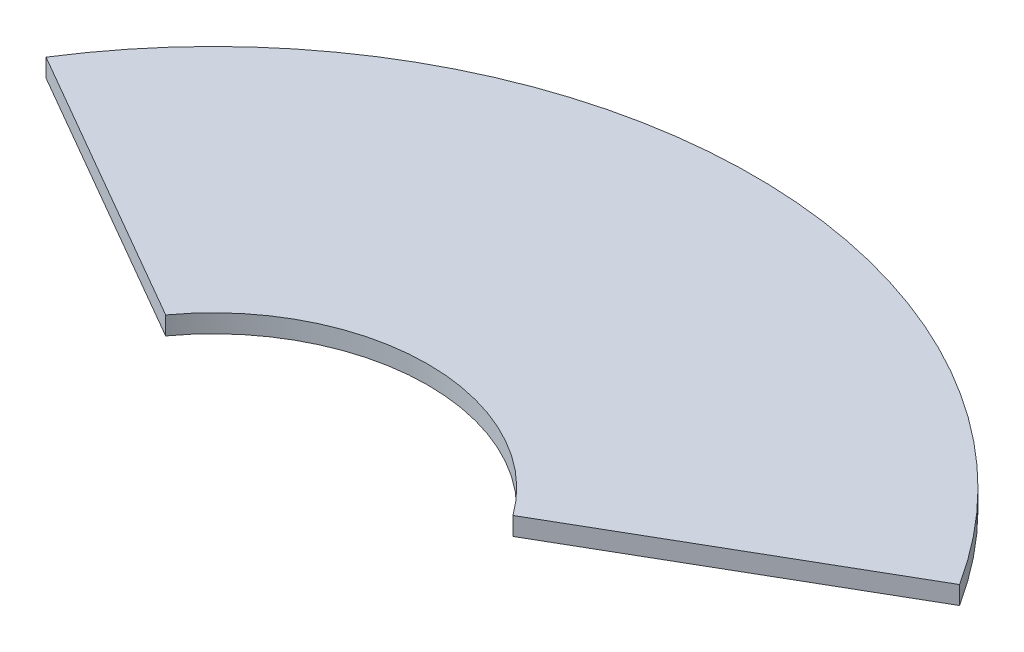
ISO-10303-21;
HEADER;
FILE_DESCRIPTION(('STEP AP214'),'2;1');
FILE_NAME('part.step','',(''),(''),'','','');
FILE_SCHEMA(('AUTOMOTIVE_DESIGN { 1 0 10303 214 1 1 1 1 }'));
ENDSEC;
DATA;
#1=APPLICATION_CONTEXT('core data for automotive mechanical design processes');
#2=APPLICATION_PROTOCOL_DEFINITION('international standard','automotive_design',2000,#1);
#3=PRODUCT_CONTEXT('',#1,'mechanical');
#4=PRODUCT('Part','Part','',(#3));
#5=PRODUCT_RELATED_PRODUCT_CATEGORY('part','',(#4));
#6=PRODUCT_DEFINITION_FORMATION('','',#4);
#7=PRODUCT_DEFINITION_CONTEXT('part definition',#1,'design');
#8=PRODUCT_DEFINITION('design','',#6,#7);
#9=PRODUCT_DEFINITION_SHAPE('','',#8);
#10=(LENGTH_UNIT() NAMED_UNIT(*) SI_UNIT(.MILLI.,.METRE.));
#11=(NAMED_UNIT(*) PLANE_ANGLE_UNIT() SI_UNIT($,.RADIAN.));
#12=(NAMED_UNIT(*) SI_UNIT($,.STERADIAN.) SOLID_ANGLE_UNIT());
#13=UNCERTAINTY_MEASURE_WITH_UNIT(LENGTH_MEASURE(1.E-05),#10,'distance_accuracy_value','');
#14=(GEOMETRIC_REPRESENTATION_CONTEXT(3) GLOBAL_UNCERTAINTY_ASSIGNED_CONTEXT((#13)) GLOBAL_UNIT_ASSIGNED_CONTEXT((#10,
#11,#12)) REPRESENTATION_CONTEXT('',''));
#15=CARTESIAN_POINT('',(0.,0.,0.));
#16=DIRECTION('',(0.,0.,1.));
#17=DIRECTION('',(1.,0.,0.));
#18=AXIS2_PLACEMENT_3D('',#15,#16,#17);
#19=CARTESIAN_POINT('',(11.,145.863295464487,-8.66025403784442));
#20=DIRECTION('',(0.981980506061966,0.,0.188982236504611));
#21=DIRECTION('',(0.188982236504611,0.,-0.981980506061966));
#22=AXIS2_PLACEMENT_3D('',#19,#20,#21);
#23=PLANE('',#22);
#24=DIRECTION('',(0.188982236504611,0.,-0.981980506061966));
#25=VECTOR('',#24,1.);
#26=CARTESIAN_POINT('',(11.,146.999,-8.66025403784442));
#27=LINE('',#26,#25);
#28=CARTESIAN_POINT('',(10.8461182539131,146.999,-7.86066103010504));
#29=VERTEX_POINT('',#28);
#30=CARTESIAN_POINT('',(10.8487709779865,146.999,-7.87444498872569));
#31=VERTEX_POINT('',#30);
#32=EDGE_CURVE('E112',#29,#31,#27,.T.);
#33=ORIENTED_EDGE('',*,*,#32,.F.);
#34=DIRECTION('',(0.,1.,0.));
#35=VECTOR('',#34,1.);
#36=CARTESIAN_POINT('',(10.8461182539131,145.863295464487,-7.86066103010504));
#37=LINE('',#36,#35);
#38=CARTESIAN_POINT('',(10.8461182539131,145.863295464487,-7.86066103010504));
#39=VERTEX_POINT('',#38);
#40=EDGE_CURVE('E32',#39,#29,#37,.T.);
#41=ORIENTED_EDGE('',*,*,#40,.F.);
#42=DIRECTION('',(0.188982236504611,0.,-0.981980506061966));
#43=VECTOR('',#42,1.);
#44=CARTESIAN_POINT('',(11.,145.863295464487,-8.66025403784442));
#45=LINE('',#44,#43);
#46=CARTESIAN_POINT('',(10.8487709779865,145.863295464487,-7.87444498872569));
#47=VERTEX_POINT('',#46);
#48=EDGE_CURVE('E132',#39,#47,#45,.T.);
#49=ORIENTED_EDGE('',*,*,#48,.T.);
#50=DIRECTION('',(0.,1.,0.));
#51=VECTOR('',#50,1.);
#52=CARTESIAN_POINT('',(10.8487709779865,145.863295464487,-7.87444498872569));
#53=LINE('',#52,#51);
#54=EDGE_CURVE('E10',#47,#31,#53,.T.);
#55=ORIENTED_EDGE('',*,*,#54,.T.);
#56=EDGE_LOOP('',(#33,#41,#49,#55));
#57=FACE_BOUND('',#56,.T.);
#58=ADVANCED_FACE('F16',(#57),#23,.T.);
#59=CARTESIAN_POINT('',(10.8487709779865,145.863295464487,-7.87444498872569));
#60=DIRECTION('',(0.500000000000004,0.,0.866025403784436));
#61=DIRECTION('',(0.866025403784436,0.,-0.500000000000004));
#62=AXIS2_PLACEMENT_3D('',#59,#60,#61);
#63=PLANE('',#62);
#64=DIRECTION('',(0.866025403784436,0.,-0.500000000000004));
#65=VECTOR('',#64,1.);
#66=CARTESIAN_POINT('',(10.8487709779865,146.999,-7.87444498872569));
#67=LINE('',#66,#65);
#68=CARTESIAN_POINT('',(28.5152924804553,146.999,-18.0742159338205));
#69=VERTEX_POINT('',#68);
#70=EDGE_CURVE('E115',#31,#69,#67,.T.);
#71=ORIENTED_EDGE('',*,*,#70,.F.);
#72=ORIENTED_EDGE('',*,*,#54,.F.);
#73=DIRECTION('',(0.866025403784436,0.,-0.500000000000004));
#74=VECTOR('',#73,1.);
#75=CARTESIAN_POINT('',(10.8487709779865,145.863295464487,-7.87444498872569));
#76=LINE('',#75,#74);
#77=CARTESIAN_POINT('',(28.5152924804553,145.863295464487,-18.0742159338205));
#78=VERTEX_POINT('',#77);
#79=EDGE_CURVE('E141',#47,#78,#76,.T.);
#80=ORIENTED_EDGE('',*,*,#79,.T.);
#81=DIRECTION('',(0.,1.,0.));
#82=VECTOR('',#81,1.);
#83=CARTESIAN_POINT('',(28.5152924804553,145.863295464487,-18.0742159338205));
#84=LINE('',#83,#82);
#85=EDGE_CURVE('E24',#78,#69,#84,.T.);
#86=ORIENTED_EDGE('',*,*,#85,.T.);
#87=EDGE_LOOP('',(#71,#72,#80,#86));
#88=FACE_BOUND('',#87,.T.);
#89=ADVANCED_FACE('F140',(#88),#63,.T.);
#90=CARTESIAN_POINT('',(28.5152924804554,145.863295464487,-18.0742159338205));
#91=DIRECTION('',(0.229549731573595,0.,-0.973296933486637));
#92=DIRECTION('',(-0.973296933486637,0.,-0.229549731573595));
#93=AXIS2_PLACEMENT_3D('',#90,#91,#92);
#94=PLANE('',#93);
#95=DIRECTION('',(-0.973296933486637,0.,-0.229549731573595));
#96=VECTOR('',#95,1.);
#97=CARTESIAN_POINT('',(28.5152924804554,146.999,-18.0742159338205));
#98=LINE('',#97,#96);
#99=CARTESIAN_POINT('',(28.5067781376292,146.999,-18.0762240210167));
#100=VERTEX_POINT('',#99);
#101=EDGE_CURVE('E118',#69,#100,#98,.T.);
#102=ORIENTED_EDGE('',*,*,#101,.F.);
#103=ORIENTED_EDGE('',*,*,#85,.F.);
#104=DIRECTION('',(-0.973296933486637,0.,-0.229549731573595));
#105=VECTOR('',#104,1.);
#106=CARTESIAN_POINT('',(28.5152924804554,145.863295464487,-18.0742159338205));
#107=LINE('',#106,#105);
#108=CARTESIAN_POINT('',(28.5067781376292,145.863295464487,-18.0762240210167));
#109=VERTEX_POINT('',#108);
#110=EDGE_CURVE('E150',#78,#109,#107,.T.);
#111=ORIENTED_EDGE('',*,*,#110,.T.);
#112=DIRECTION('',(0.,1.,0.));
#113=VECTOR('',#112,1.);
#114=CARTESIAN_POINT('',(28.5067781376292,145.863295464487,-18.0762240210167));
#115=LINE('',#114,#113);
#116=EDGE_CURVE('E138',#109,#100,#115,.T.);
#117=ORIENTED_EDGE('',*,*,#116,.T.);
#118=EDGE_LOOP('',(#102,#103,#111,#117));
#119=FACE_BOUND('',#118,.T.);
#120=ADVANCED_FACE('F145',(#119),#94,.T.);
#121=CARTESIAN_POINT('',(0.,145.863295464487,0.));
#122=DIRECTION('',(0.,1.,0.));
#123=DIRECTION('',(0.,0.,1.));
#124=AXIS2_PLACEMENT_3D('',#121,#122,#123);
#125=CYLINDRICAL_SURFACE('',#124,33.7547963206119);
#126=CARTESIAN_POINT('',(0.,146.999,0.));
#127=DIRECTION('',(0.,1.,0.));
#128=DIRECTION('',(0.844525259962001,0.,-0.535515718990689));
#129=AXIS2_PLACEMENT_3D('',#126,#127,#128);
#130=CIRCLE('',#129,33.7547963206119);
#131=CARTESIAN_POINT('',(-28.5067781376294,146.999,-18.0762240210163));
#132=VERTEX_POINT('',#131);
#133=EDGE_CURVE('E121',#100,#132,#130,.T.);
#134=ORIENTED_EDGE('',*,*,#133,.F.);
#135=ORIENTED_EDGE('',*,*,#116,.F.);
#136=CARTESIAN_POINT('',(0.,145.863295464487,0.));
#137=DIRECTION('',(0.,1.,0.));
#138=DIRECTION('',(0.844525259962001,0.,-0.535515718990689));
#139=AXIS2_PLACEMENT_3D('',#136,#137,#138);
#140=CIRCLE('',#139,33.7547963206119);
#141=CARTESIAN_POINT('',(-28.5067781376294,145.863295464487,-18.0762240210163));
#142=VERTEX_POINT('',#141);
#143=EDGE_CURVE('E154',#109,#142,#140,.T.);
#144=ORIENTED_EDGE('',*,*,#143,.T.);
#145=DIRECTION('',(0.,1.,0.));
#146=VECTOR('',#145,1.);
#147=CARTESIAN_POINT('',(-28.5067781376294,145.863295464487,-18.0762240210163));
#148=LINE('',#147,#146);
#149=EDGE_CURVE('E136',#142,#132,#148,.T.);
#150=ORIENTED_EDGE('',*,*,#149,.T.);
#151=EDGE_LOOP('',(#134,#135,#144,#150));
#152=FACE_BOUND('',#151,.T.);
#153=ADVANCED_FACE('F161',(#152),#125,.T.);
#154=CARTESIAN_POINT('',(-27.6563416990851,145.863295464487,-18.2767974015252));
#155=DIRECTION('',(-0.229549731573615,0.,-0.973296933486632));
#156=DIRECTION('',(-0.973296933486632,0.,0.229549731573615));
#157=AXIS2_PLACEMENT_3D('',#154,#155,#156);
#158=PLANE('',#157);
#159=DIRECTION('',(-0.973296933486632,0.,0.229549731573615));
#160=VECTOR('',#159,1.);
#161=CARTESIAN_POINT('',(-27.6563416990851,146.999,-18.2767974015252));
#162=LINE('',#161,#160);
#163=CARTESIAN_POINT('',(-28.5152924804556,146.999,-18.0742159338201));
#164=VERTEX_POINT('',#163);
#165=EDGE_CURVE('E124',#132,#164,#162,.T.);
#166=ORIENTED_EDGE('',*,*,#165,.F.);
#167=ORIENTED_EDGE('',*,*,#149,.F.);
#168=DIRECTION('',(-0.973296933486632,0.,0.229549731573615));
#169=VECTOR('',#168,1.);
#170=CARTESIAN_POINT('',(-27.6563416990851,145.863295464487,-18.2767974015252));
#171=LINE('',#170,#169);
#172=CARTESIAN_POINT('',(-28.5152924804556,145.863295464487,-18.0742159338201));
#173=VERTEX_POINT('',#172);
#174=EDGE_CURVE('E103',#142,#173,#171,.T.);
#175=ORIENTED_EDGE('',*,*,#174,.T.);
#176=DIRECTION('',(0.,1.,0.));
#177=VECTOR('',#176,1.);
#178=CARTESIAN_POINT('',(-28.5152924804556,145.863295464487,-18.0742159338201));
#179=LINE('',#178,#177);
#180=EDGE_CURVE('E95',#173,#164,#179,.T.);
#181=ORIENTED_EDGE('',*,*,#180,.T.);
#182=EDGE_LOOP('',(#166,#167,#175,#181));
#183=FACE_BOUND('',#182,.T.);
#184=ADVANCED_FACE('F158',(#183),#158,.T.);
#185=CARTESIAN_POINT('',(-28.5152924804556,145.863295464487,-18.0742159338201));
#186=DIRECTION('',(-0.499999999999992,0.,0.866025403784443));
#187=DIRECTION('',(0.866025403784444,0.,0.499999999999992));
#188=AXIS2_PLACEMENT_3D('',#185,#186,#187);
#189=PLANE('',#188);
#190=DIRECTION('',(0.866025403784443,0.,0.499999999999992));
#191=VECTOR('',#190,1.);
#192=CARTESIAN_POINT('',(-28.5152924804556,146.999,-18.0742159338201));
#193=LINE('',#192,#191);
#194=CARTESIAN_POINT('',(-10.8487709779866,146.999,-7.87444498872553));
#195=VERTEX_POINT('',#194);
#196=EDGE_CURVE('E127',#164,#195,#193,.T.);
#197=ORIENTED_EDGE('',*,*,#196,.F.);
#198=ORIENTED_EDGE('',*,*,#180,.F.);
#199=DIRECTION('',(0.866025403784443,0.,0.499999999999992));
#200=VECTOR('',#199,1.);
#201=CARTESIAN_POINT('',(-28.5152924804556,145.863295464487,-18.0742159338201));
#202=LINE('',#201,#200);
#203=CARTESIAN_POINT('',(-10.8487709779866,145.863295464487,-7.87444498872553));
#204=VERTEX_POINT('',#203);
#205=EDGE_CURVE('E98',#173,#204,#202,.T.);
#206=ORIENTED_EDGE('',*,*,#205,.T.);
#207=DIRECTION('',(0.,1.,0.));
#208=VECTOR('',#207,1.);
#209=CARTESIAN_POINT('',(-10.8487709779866,145.863295464487,-7.87444498872553));
#210=LINE('',#209,#208);
#211=EDGE_CURVE('E84',#204,#195,#210,.T.);
#212=ORIENTED_EDGE('',*,*,#211,.T.);
#213=EDGE_LOOP('',(#197,#198,#206,#212));
#214=FACE_BOUND('',#213,.T.);
#215=ADVANCED_FACE('F99',(#214),#189,.T.);
#216=CARTESIAN_POINT('',(-11.0000000000001,145.863295464487,-8.66025403784426));
#217=DIRECTION('',(-0.981980506061965,0.,0.188982236504619));
#218=DIRECTION('',(0.188982236504619,0.,0.981980506061965));
#219=AXIS2_PLACEMENT_3D('',#216,#217,#218);
#220=PLANE('',#219);
#221=DIRECTION('',(0.188982236504619,0.,0.981980506061965));
#222=VECTOR('',#221,1.);
#223=CARTESIAN_POINT('',(-11.0000000000001,146.999,-8.66025403784426));
#224=LINE('',#223,#222);
#225=CARTESIAN_POINT('',(-10.8461182539133,146.999,-7.86066103010488));
#226=VERTEX_POINT('',#225);
#227=EDGE_CURVE('E91',#195,#226,#224,.T.);
#228=ORIENTED_EDGE('',*,*,#227,.F.);
#229=ORIENTED_EDGE('',*,*,#211,.F.);
#230=DIRECTION('',(0.188982236504619,0.,0.981980506061965));
#231=VECTOR('',#230,1.);
#232=CARTESIAN_POINT('',(-11.0000000000001,145.863295464487,-8.66025403784426));
#233=LINE('',#232,#231);
#234=CARTESIAN_POINT('',(-10.8461182539133,145.863295464487,-7.86066103010488));
#235=VERTEX_POINT('',#234);
#236=EDGE_CURVE('E88',#204,#235,#233,.T.);
#237=ORIENTED_EDGE('',*,*,#236,.T.);
#238=DIRECTION('',(0.,1.,0.));
#239=VECTOR('',#238,1.);
#240=CARTESIAN_POINT('',(-10.8461182539133,145.863295464487,-7.86066103010488));
#241=LINE('',#240,#239);
#242=EDGE_CURVE('E60',#235,#226,#241,.T.);
#243=ORIENTED_EDGE('',*,*,#242,.T.);
#244=EDGE_LOOP('',(#228,#229,#237,#243));
#245=FACE_BOUND('',#244,.T.);
#246=ADVANCED_FACE('F86',(#245),#220,.T.);
#247=CARTESIAN_POINT('',(0.,145.863295464487,0.));
#248=DIRECTION('',(0.,1.,0.));
#249=DIRECTION('',(0.,0.,1.));
#250=AXIS2_PLACEMENT_3D('',#247,#248,#249);
#251=CYLINDRICAL_SURFACE('',#250,13.3950839119462);
#252=CARTESIAN_POINT('',(0.,146.999,0.));
#253=DIRECTION('',(0.,-1.,0.));
#254=DIRECTION('',(-0.809708869702586,0.,-0.586831787077831));
#255=AXIS2_PLACEMENT_3D('',#252,#253,#254);
#256=CIRCLE('',#255,13.3950839119462);
#257=EDGE_CURVE('E130',#226,#29,#256,.T.);
#258=ORIENTED_EDGE('',*,*,#257,.F.);
#259=ORIENTED_EDGE('',*,*,#242,.F.);
#260=CARTESIAN_POINT('',(0.,145.863295464487,0.));
#261=DIRECTION('',(0.,-1.,0.));
#262=DIRECTION('',(-0.809708869702586,0.,-0.586831787077831));
#263=AXIS2_PLACEMENT_3D('',#260,#261,#262);
#264=CIRCLE('',#263,13.3950839119462);
#265=EDGE_CURVE('E107',#235,#39,#264,.T.);
#266=ORIENTED_EDGE('',*,*,#265,.T.);
#267=ORIENTED_EDGE('',*,*,#40,.T.);
#268=EDGE_LOOP('',(#258,#259,#266,#267));
#269=FACE_BOUND('',#268,.T.);
#270=ADVANCED_FACE('F217',(#269),#251,.F.);
#271=CARTESIAN_POINT('',(0.,145.863295464487,-33.15));
#272=DIRECTION('',(0.,1.,0.));
#273=DIRECTION('',(-1.,0.,0.));
#274=AXIS2_PLACEMENT_3D('',#271,#272,#273);
#275=PLANE('',#274);
#276=ORIENTED_EDGE('',*,*,#48,.F.);
#277=ORIENTED_EDGE('',*,*,#265,.F.);
#278=ORIENTED_EDGE('',*,*,#236,.F.);
#279=ORIENTED_EDGE('',*,*,#205,.F.);
#280=ORIENTED_EDGE('',*,*,#174,.F.);
#281=ORIENTED_EDGE('',*,*,#143,.F.);
#282=ORIENTED_EDGE('',*,*,#110,.F.);
#283=ORIENTED_EDGE('',*,*,#79,.F.);
#284=EDGE_LOOP('',(#276,#277,#278,#279,#280,#281,#282,#283));
#285=FACE_BOUND('',#284,.T.);
#286=ADVANCED_FACE('F106',(#285),#275,.F.);
#287=CARTESIAN_POINT('',(0.,146.999,-33.15));
#288=DIRECTION('',(0.,1.,0.));
#289=DIRECTION('',(-1.,0.,0.));
#290=AXIS2_PLACEMENT_3D('',#287,#288,#289);
#291=PLANE('',#290);
#292=ORIENTED_EDGE('',*,*,#32,.T.);
#293=ORIENTED_EDGE('',*,*,#70,.T.);
#294=ORIENTED_EDGE('',*,*,#101,.T.);
#295=ORIENTED_EDGE('',*,*,#133,.T.);
#296=ORIENTED_EDGE('',*,*,#165,.T.);
#297=ORIENTED_EDGE('',*,*,#196,.T.);
#298=ORIENTED_EDGE('',*,*,#227,.T.);
#299=ORIENTED_EDGE('',*,*,#257,.T.);
#300=EDGE_LOOP('',(#292,#293,#294,#295,#296,#297,#298,#299));
#301=FACE_BOUND('',#300,.T.);
#302=ADVANCED_FACE('F148',(#301),#291,.T.);
#303=CLOSED_SHELL('',(#58,#89,#120,#153,#184,#215,#246,#270,#286,#302));
#304=MANIFOLD_SOLID_BREP('B1',#303);
#305=ADVANCED_BREP_SHAPE_REPRESENTATION('',(#18,#304),#14);
#306=SHAPE_DEFINITION_REPRESENTATION(#9,#305);
ENDSEC;
END-ISO-10303-21;
